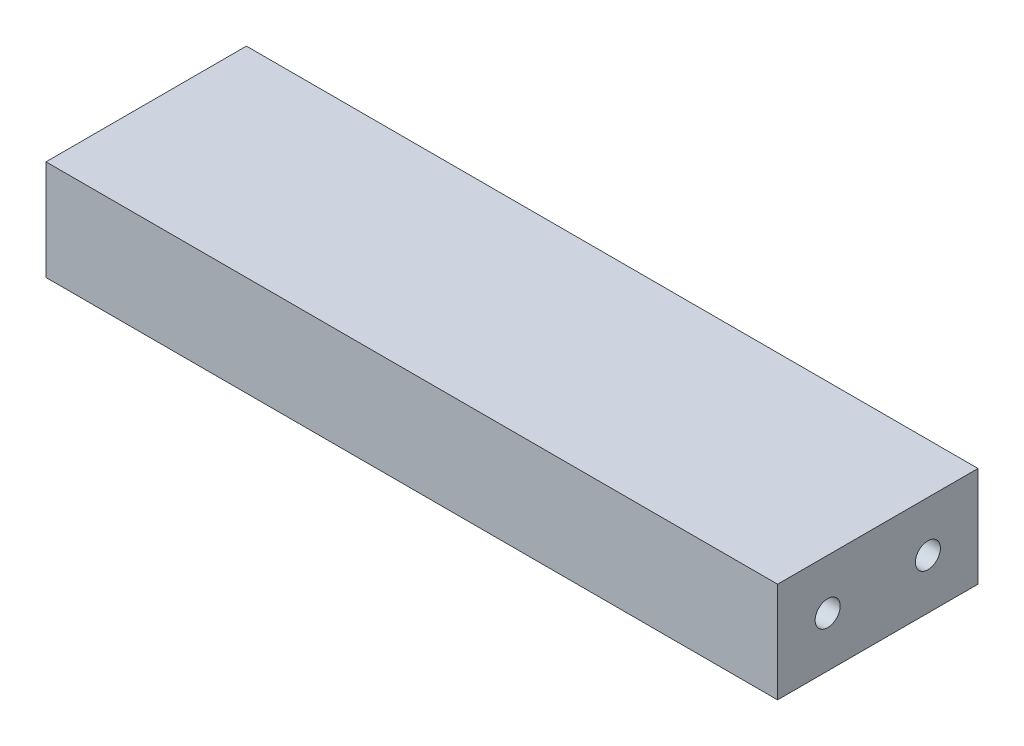
ISO-10303-21;
HEADER;
FILE_DESCRIPTION(('STEP AP214'),'2;1');
FILE_NAME('part.step','',(''),(''),'','','');
FILE_SCHEMA(('AUTOMOTIVE_DESIGN { 1 0 10303 214 1 1 1 1 }'));
ENDSEC;
DATA;
#1=APPLICATION_CONTEXT('core data for automotive mechanical design processes');
#2=APPLICATION_PROTOCOL_DEFINITION('international standard','automotive_design',2000,#1);
#3=PRODUCT_CONTEXT('',#1,'mechanical');
#4=PRODUCT('Part','Part','',(#3));
#5=PRODUCT_RELATED_PRODUCT_CATEGORY('part','',(#4));
#6=PRODUCT_DEFINITION_FORMATION('','',#4);
#7=PRODUCT_DEFINITION_CONTEXT('part definition',#1,'design');
#8=PRODUCT_DEFINITION('design','',#6,#7);
#9=PRODUCT_DEFINITION_SHAPE('','',#8);
#10=(LENGTH_UNIT() NAMED_UNIT(*) SI_UNIT(.MILLI.,.METRE.));
#11=(NAMED_UNIT(*) PLANE_ANGLE_UNIT() SI_UNIT($,.RADIAN.));
#12=(NAMED_UNIT(*) SI_UNIT($,.STERADIAN.) SOLID_ANGLE_UNIT());
#13=UNCERTAINTY_MEASURE_WITH_UNIT(LENGTH_MEASURE(1.E-05),#10,'distance_accuracy_value','');
#14=(GEOMETRIC_REPRESENTATION_CONTEXT(3) GLOBAL_UNCERTAINTY_ASSIGNED_CONTEXT((#13)) GLOBAL_UNIT_ASSIGNED_CONTEXT((#10,
#11,#12)) REPRESENTATION_CONTEXT('',''));
#15=CARTESIAN_POINT('',(0.,0.,0.));
#16=DIRECTION('',(0.,0.,1.));
#17=DIRECTION('',(1.,0.,0.));
#18=AXIS2_PLACEMENT_3D('',#15,#16,#17);
#19=CARTESIAN_POINT('',(-36.5,10.,10.));
#20=DIRECTION('',(1.,0.,0.));
#21=DIRECTION('',(0.,0.,-1.));
#22=AXIS2_PLACEMENT_3D('',#19,#20,#21);
#23=PLANE('',#22);
#24=CARTESIAN_POINT('',(-36.5,5.,5.));
#25=DIRECTION('',(1.,0.,0.));
#26=DIRECTION('',(0.,0.,-1.));
#27=AXIS2_PLACEMENT_3D('',#24,#25,#26);
#28=CIRCLE('',#27,1.25);
#29=CARTESIAN_POINT('',(-36.5,5.,3.75));
#30=VERTEX_POINT('',#29);
#31=EDGE_CURVE('E152',#30,#30,#28,.T.);
#32=ORIENTED_EDGE('',*,*,#31,.T.);
#33=EDGE_LOOP('',(#32));
#34=FACE_BOUND('',#33,.T.);
#35=CARTESIAN_POINT('',(-36.5,5.,-5.));
#36=DIRECTION('',(1.,0.,0.));
#37=DIRECTION('',(0.,0.,-1.));
#38=AXIS2_PLACEMENT_3D('',#35,#36,#37);
#39=CIRCLE('',#38,1.25);
#40=CARTESIAN_POINT('',(-36.5,5.,-6.25));
#41=VERTEX_POINT('',#40);
#42=EDGE_CURVE('E144',#41,#41,#39,.T.);
#43=ORIENTED_EDGE('',*,*,#42,.T.);
#44=EDGE_LOOP('',(#43));
#45=FACE_BOUND('',#44,.T.);
#46=DIRECTION('',(0.,0.,1.));
#47=VECTOR('',#46,1.);
#48=CARTESIAN_POINT('',(-36.5,0.,10.));
#49=LINE('',#48,#47);
#50=CARTESIAN_POINT('',(-36.5,0.,-9.99999999999999));
#51=VERTEX_POINT('',#50);
#52=CARTESIAN_POINT('',(-36.5,0.,10.));
#53=VERTEX_POINT('',#52);
#54=EDGE_CURVE('E107',#51,#53,#49,.T.);
#55=ORIENTED_EDGE('',*,*,#54,.T.);
#56=DIRECTION('',(0.,-1.,0.));
#57=VECTOR('',#56,1.);
#58=CARTESIAN_POINT('',(-36.5,10.,10.));
#59=LINE('',#58,#57);
#60=CARTESIAN_POINT('',(-36.5,10.,10.));
#61=VERTEX_POINT('',#60);
#62=EDGE_CURVE('E11',#61,#53,#59,.T.);
#63=ORIENTED_EDGE('',*,*,#62,.F.);
#64=DIRECTION('',(0.,0.,1.));
#65=VECTOR('',#64,1.);
#66=CARTESIAN_POINT('',(-36.5,10.,10.));
#67=LINE('',#66,#65);
#68=CARTESIAN_POINT('',(-36.5,10.,-9.99999999999999));
#69=VERTEX_POINT('',#68);
#70=EDGE_CURVE('E91',#69,#61,#67,.T.);
#71=ORIENTED_EDGE('',*,*,#70,.F.);
#72=DIRECTION('',(0.,-1.,0.));
#73=VECTOR('',#72,1.);
#74=CARTESIAN_POINT('',(-36.5,10.,-9.99999999999999));
#75=LINE('',#74,#73);
#76=EDGE_CURVE('E103',#69,#51,#75,.T.);
#77=ORIENTED_EDGE('',*,*,#76,.T.);
#78=EDGE_LOOP('',(#55,#63,#71,#77));
#79=FACE_BOUND('',#78,.T.);
#80=ADVANCED_FACE('F39',(#34,#45,#79),#23,.F.);
#81=CARTESIAN_POINT('',(36.5,10.,10.));
#82=DIRECTION('',(0.,0.,-1.));
#83=DIRECTION('',(-1.,0.,0.));
#84=AXIS2_PLACEMENT_3D('',#81,#82,#83);
#85=PLANE('',#84);
#86=DIRECTION('',(1.,0.,0.));
#87=VECTOR('',#86,1.);
#88=CARTESIAN_POINT('',(36.5,0.,10.));
#89=LINE('',#88,#87);
#90=CARTESIAN_POINT('',(36.5,0.,10.));
#91=VERTEX_POINT('',#90);
#92=EDGE_CURVE('E96',#53,#91,#89,.T.);
#93=ORIENTED_EDGE('',*,*,#92,.T.);
#94=DIRECTION('',(0.,-1.,0.));
#95=VECTOR('',#94,1.);
#96=CARTESIAN_POINT('',(36.5,10.,10.));
#97=LINE('',#96,#95);
#98=CARTESIAN_POINT('',(36.5,10.,10.));
#99=VERTEX_POINT('',#98);
#100=EDGE_CURVE('E48',#99,#91,#97,.T.);
#101=ORIENTED_EDGE('',*,*,#100,.F.);
#102=DIRECTION('',(1.,0.,0.));
#103=VECTOR('',#102,1.);
#104=CARTESIAN_POINT('',(36.5,10.,10.));
#105=LINE('',#104,#103);
#106=EDGE_CURVE('E86',#61,#99,#105,.T.);
#107=ORIENTED_EDGE('',*,*,#106,.F.);
#108=ORIENTED_EDGE('',*,*,#62,.T.);
#109=EDGE_LOOP('',(#93,#101,#107,#108));
#110=FACE_BOUND('',#109,.T.);
#111=ADVANCED_FACE('F95',(#110),#85,.F.);
#112=CARTESIAN_POINT('',(36.5,10.,10.));
#113=DIRECTION('',(-1.,0.,0.));
#114=DIRECTION('',(0.,0.,1.));
#115=AXIS2_PLACEMENT_3D('',#112,#113,#114);
#116=PLANE('',#115);
#117=CARTESIAN_POINT('',(36.5,5.,5.));
#118=DIRECTION('',(1.,0.,0.));
#119=DIRECTION('',(0.,0.,-1.));
#120=AXIS2_PLACEMENT_3D('',#117,#118,#119);
#121=CIRCLE('',#120,1.25);
#122=CARTESIAN_POINT('',(36.5,5.,3.75));
#123=VERTEX_POINT('',#122);
#124=EDGE_CURVE('E137',#123,#123,#121,.T.);
#125=ORIENTED_EDGE('',*,*,#124,.F.);
#126=EDGE_LOOP('',(#125));
#127=FACE_BOUND('',#126,.T.);
#128=CARTESIAN_POINT('',(36.5,5.,-5.));
#129=DIRECTION('',(1.,0.,0.));
#130=DIRECTION('',(0.,0.,-1.));
#131=AXIS2_PLACEMENT_3D('',#128,#129,#130);
#132=CIRCLE('',#131,1.25);
#133=CARTESIAN_POINT('',(36.5,5.,-6.25));
#134=VERTEX_POINT('',#133);
#135=EDGE_CURVE('E128',#134,#134,#132,.T.);
#136=ORIENTED_EDGE('',*,*,#135,.F.);
#137=EDGE_LOOP('',(#136));
#138=FACE_BOUND('',#137,.T.);
#139=DIRECTION('',(0.,0.,-1.));
#140=VECTOR('',#139,1.);
#141=CARTESIAN_POINT('',(36.5,0.,10.));
#142=LINE('',#141,#140);
#143=CARTESIAN_POINT('',(36.5,0.,-10.));
#144=VERTEX_POINT('',#143);
#145=EDGE_CURVE('E73',#91,#144,#142,.T.);
#146=ORIENTED_EDGE('',*,*,#145,.T.);
#147=DIRECTION('',(0.,-1.,0.));
#148=VECTOR('',#147,1.);
#149=CARTESIAN_POINT('',(36.5,10.,-10.));
#150=LINE('',#149,#148);
#151=CARTESIAN_POINT('',(36.5,10.,-10.));
#152=VERTEX_POINT('',#151);
#153=EDGE_CURVE('E98',#152,#144,#150,.T.);
#154=ORIENTED_EDGE('',*,*,#153,.F.);
#155=DIRECTION('',(0.,0.,-1.));
#156=VECTOR('',#155,1.);
#157=CARTESIAN_POINT('',(36.5,10.,10.));
#158=LINE('',#157,#156);
#159=EDGE_CURVE('E89',#99,#152,#158,.T.);
#160=ORIENTED_EDGE('',*,*,#159,.F.);
#161=ORIENTED_EDGE('',*,*,#100,.T.);
#162=EDGE_LOOP('',(#146,#154,#160,#161));
#163=FACE_BOUND('',#162,.T.);
#164=ADVANCED_FACE('F99',(#127,#138,#163),#116,.F.);
#165=CARTESIAN_POINT('',(36.5,10.,-10.));
#166=DIRECTION('',(0.,0.,1.));
#167=DIRECTION('',(1.,0.,0.));
#168=AXIS2_PLACEMENT_3D('',#165,#166,#167);
#169=PLANE('',#168);
#170=DIRECTION('',(-1.,0.,0.));
#171=VECTOR('',#170,1.);
#172=CARTESIAN_POINT('',(36.5,0.,-10.));
#173=LINE('',#172,#171);
#174=EDGE_CURVE('E79',#144,#51,#173,.T.);
#175=ORIENTED_EDGE('',*,*,#174,.T.);
#176=ORIENTED_EDGE('',*,*,#76,.F.);
#177=DIRECTION('',(-1.,0.,0.));
#178=VECTOR('',#177,1.);
#179=CARTESIAN_POINT('',(36.5,10.,-10.));
#180=LINE('',#179,#178);
#181=EDGE_CURVE('E56',#152,#69,#180,.T.);
#182=ORIENTED_EDGE('',*,*,#181,.F.);
#183=ORIENTED_EDGE('',*,*,#153,.T.);
#184=EDGE_LOOP('',(#175,#176,#182,#183));
#185=FACE_BOUND('',#184,.T.);
#186=ADVANCED_FACE('F121',(#185),#169,.F.);
#187=CARTESIAN_POINT('',(0.,10.,0.));
#188=DIRECTION('',(0.,1.,0.));
#189=DIRECTION('',(0.,0.,1.));
#190=AXIS2_PLACEMENT_3D('',#187,#188,#189);
#191=PLANE('',#190);
#192=ORIENTED_EDGE('',*,*,#70,.T.);
#193=ORIENTED_EDGE('',*,*,#106,.T.);
#194=ORIENTED_EDGE('',*,*,#159,.T.);
#195=ORIENTED_EDGE('',*,*,#181,.T.);
#196=EDGE_LOOP('',(#192,#193,#194,#195));
#197=FACE_BOUND('',#196,.T.);
#198=ADVANCED_FACE('F87',(#197),#191,.T.);
#199=CARTESIAN_POINT('',(0.,0.,0.));
#200=DIRECTION('',(0.,1.,0.));
#201=DIRECTION('',(0.,0.,1.));
#202=AXIS2_PLACEMENT_3D('',#199,#200,#201);
#203=PLANE('',#202);
#204=ORIENTED_EDGE('',*,*,#54,.F.);
#205=ORIENTED_EDGE('',*,*,#174,.F.);
#206=ORIENTED_EDGE('',*,*,#145,.F.);
#207=ORIENTED_EDGE('',*,*,#92,.F.);
#208=EDGE_LOOP('',(#204,#205,#206,#207));
#209=FACE_BOUND('',#208,.T.);
#210=ADVANCED_FACE('F124',(#209),#203,.F.);
#211=CARTESIAN_POINT('',(16.5,5.,-5.));
#212=DIRECTION('',(1.,0.,0.));
#213=DIRECTION('',(0.,0.,-1.));
#214=AXIS2_PLACEMENT_3D('',#211,#212,#213);
#215=CYLINDRICAL_SURFACE('',#214,1.25);
#216=CARTESIAN_POINT('',(16.5,5.,-5.));
#217=DIRECTION('',(1.,0.,0.));
#218=DIRECTION('',(0.,0.,-1.));
#219=AXIS2_PLACEMENT_3D('',#216,#217,#218);
#220=CIRCLE('',#219,1.25);
#221=CARTESIAN_POINT('',(16.5,5.,-6.25));
#222=VERTEX_POINT('',#221);
#223=EDGE_CURVE('E132',#222,#222,#220,.T.);
#224=ORIENTED_EDGE('',*,*,#223,.F.);
#225=EDGE_LOOP('',(#224));
#226=FACE_BOUND('',#225,.T.);
#227=ORIENTED_EDGE('',*,*,#135,.T.);
#228=EDGE_LOOP('',(#227));
#229=FACE_BOUND('',#228,.T.);
#230=ADVANCED_FACE('F201',(#226,#229),#215,.F.);
#231=CARTESIAN_POINT('',(16.5,5.,-5.));
#232=DIRECTION('',(1.,0.,0.));
#233=DIRECTION('',(0.,0.,-1.));
#234=AXIS2_PLACEMENT_3D('',#231,#232,#233);
#235=PLANE('',#234);
#236=ORIENTED_EDGE('',*,*,#223,.T.);
#237=EDGE_LOOP('',(#236));
#238=FACE_BOUND('',#237,.T.);
#239=ADVANCED_FACE('F197',(#238),#235,.T.);
#240=CARTESIAN_POINT('',(16.5,5.,5.));
#241=DIRECTION('',(1.,0.,0.));
#242=DIRECTION('',(0.,0.,-1.));
#243=AXIS2_PLACEMENT_3D('',#240,#241,#242);
#244=CYLINDRICAL_SURFACE('',#243,1.25);
#245=CARTESIAN_POINT('',(16.5,5.,5.));
#246=DIRECTION('',(1.,0.,0.));
#247=DIRECTION('',(0.,0.,-1.));
#248=AXIS2_PLACEMENT_3D('',#245,#246,#247);
#249=CIRCLE('',#248,1.25);
#250=CARTESIAN_POINT('',(16.5,5.,3.75));
#251=VERTEX_POINT('',#250);
#252=EDGE_CURVE('E111',#251,#251,#249,.T.);
#253=ORIENTED_EDGE('',*,*,#252,.F.);
#254=EDGE_LOOP('',(#253));
#255=FACE_BOUND('',#254,.T.);
#256=ORIENTED_EDGE('',*,*,#124,.T.);
#257=EDGE_LOOP('',(#256));
#258=FACE_BOUND('',#257,.T.);
#259=ADVANCED_FACE('F191',(#255,#258),#244,.F.);
#260=CARTESIAN_POINT('',(16.5,5.,5.));
#261=DIRECTION('',(1.,0.,0.));
#262=DIRECTION('',(0.,0.,-1.));
#263=AXIS2_PLACEMENT_3D('',#260,#261,#262);
#264=PLANE('',#263);
#265=ORIENTED_EDGE('',*,*,#252,.T.);
#266=EDGE_LOOP('',(#265));
#267=FACE_BOUND('',#266,.T.);
#268=ADVANCED_FACE('F182',(#267),#264,.T.);
#269=CARTESIAN_POINT('',(-16.5,5.,-5.));
#270=DIRECTION('',(-1.,0.,0.));
#271=DIRECTION('',(0.,0.,1.));
#272=AXIS2_PLACEMENT_3D('',#269,#270,#271);
#273=CYLINDRICAL_SURFACE('',#272,1.25);
#274=CARTESIAN_POINT('',(-16.5,5.,-5.));
#275=DIRECTION('',(1.,0.,0.));
#276=DIRECTION('',(0.,0.,-1.));
#277=AXIS2_PLACEMENT_3D('',#274,#275,#276);
#278=CIRCLE('',#277,1.25);
#279=CARTESIAN_POINT('',(-16.5,5.,-6.25));
#280=VERTEX_POINT('',#279);
#281=EDGE_CURVE('E148',#280,#280,#278,.T.);
#282=ORIENTED_EDGE('',*,*,#281,.T.);
#283=EDGE_LOOP('',(#282));
#284=FACE_BOUND('',#283,.T.);
#285=ORIENTED_EDGE('',*,*,#42,.F.);
#286=EDGE_LOOP('',(#285));
#287=FACE_BOUND('',#286,.T.);
#288=ADVANCED_FACE('F180',(#284,#287),#273,.F.);
#289=CARTESIAN_POINT('',(-16.5,5.,-5.));
#290=DIRECTION('',(-1.,0.,0.));
#291=DIRECTION('',(0.,0.,-1.));
#292=AXIS2_PLACEMENT_3D('',#289,#290,#291);
#293=PLANE('',#292);
#294=ORIENTED_EDGE('',*,*,#281,.F.);
#295=EDGE_LOOP('',(#294));
#296=FACE_BOUND('',#295,.T.);
#297=ADVANCED_FACE('F169',(#296),#293,.T.);
#298=CARTESIAN_POINT('',(-16.5,5.,5.));
#299=DIRECTION('',(-1.,0.,0.));
#300=DIRECTION('',(0.,0.,1.));
#301=AXIS2_PLACEMENT_3D('',#298,#299,#300);
#302=CYLINDRICAL_SURFACE('',#301,1.25);
#303=CARTESIAN_POINT('',(-16.5,5.,5.));
#304=DIRECTION('',(1.,0.,0.));
#305=DIRECTION('',(0.,0.,-1.));
#306=AXIS2_PLACEMENT_3D('',#303,#304,#305);
#307=CIRCLE('',#306,1.25);
#308=CARTESIAN_POINT('',(-16.5,5.,3.75));
#309=VERTEX_POINT('',#308);
#310=EDGE_CURVE('E133',#309,#309,#307,.T.);
#311=ORIENTED_EDGE('',*,*,#310,.T.);
#312=EDGE_LOOP('',(#311));
#313=FACE_BOUND('',#312,.T.);
#314=ORIENTED_EDGE('',*,*,#31,.F.);
#315=EDGE_LOOP('',(#314));
#316=FACE_BOUND('',#315,.T.);
#317=ADVANCED_FACE('F160',(#313,#316),#302,.F.);
#318=CARTESIAN_POINT('',(-16.5,5.,5.));
#319=DIRECTION('',(-1.,0.,0.));
#320=DIRECTION('',(0.,0.,-1.));
#321=AXIS2_PLACEMENT_3D('',#318,#319,#320);
#322=PLANE('',#321);
#323=ORIENTED_EDGE('',*,*,#310,.F.);
#324=EDGE_LOOP('',(#323));
#325=FACE_BOUND('',#324,.T.);
#326=ADVANCED_FACE('F163',(#325),#322,.T.);
#327=CLOSED_SHELL('',(#80,#111,#164,#186,#198,#210,#230,#239,#259,#268,#288,#297,#317,#326));
#328=MANIFOLD_SOLID_BREP('B2',#327);
#329=ADVANCED_BREP_SHAPE_REPRESENTATION('',(#18,#328),#14);
#330=SHAPE_DEFINITION_REPRESENTATION(#9,#329);
ENDSEC;
END-ISO-10303-21;
